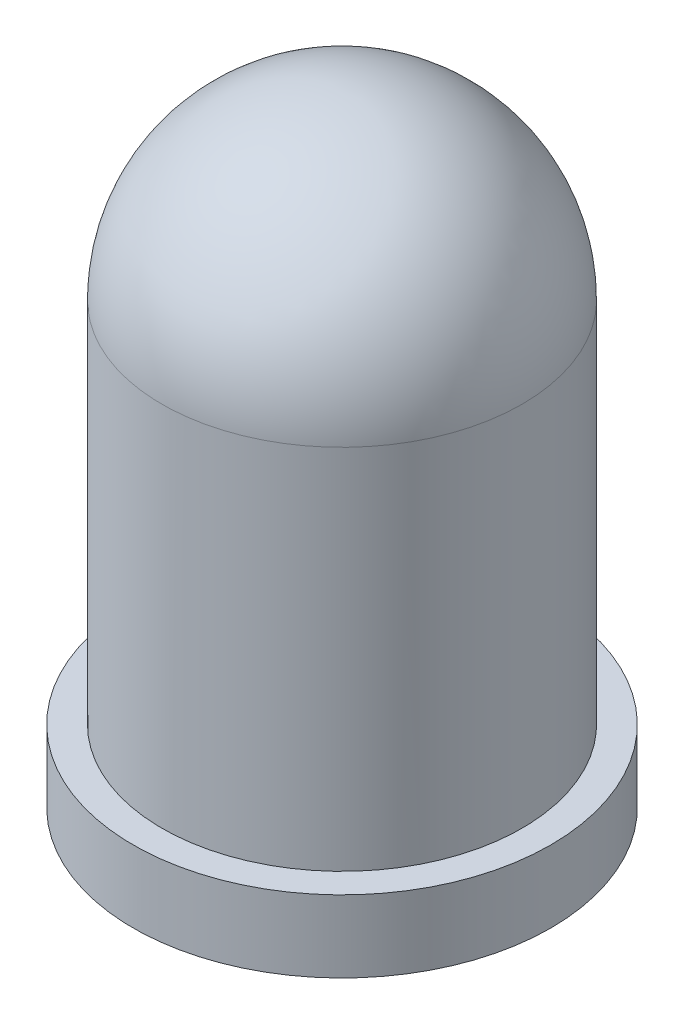
ISO-10303-21;
HEADER;
FILE_DESCRIPTION(('STEP AP214'),'2;1');
FILE_NAME('part.step','',(''),(''),'','','');
FILE_SCHEMA(('AUTOMOTIVE_DESIGN { 1 0 10303 214 1 1 1 1 }'));
ENDSEC;
DATA;
#1=APPLICATION_CONTEXT('core data for automotive mechanical design processes');
#2=APPLICATION_PROTOCOL_DEFINITION('international standard','automotive_design',2000,#1);
#3=PRODUCT_CONTEXT('',#1,'mechanical');
#4=PRODUCT('Part','Part','',(#3));
#5=PRODUCT_RELATED_PRODUCT_CATEGORY('part','',(#4));
#6=PRODUCT_DEFINITION_FORMATION('','',#4);
#7=PRODUCT_DEFINITION_CONTEXT('part definition',#1,'design');
#8=PRODUCT_DEFINITION('design','',#6,#7);
#9=PRODUCT_DEFINITION_SHAPE('','',#8);
#10=(LENGTH_UNIT() NAMED_UNIT(*) SI_UNIT(.MILLI.,.METRE.));
#11=(NAMED_UNIT(*) PLANE_ANGLE_UNIT() SI_UNIT($,.RADIAN.));
#12=(NAMED_UNIT(*) SI_UNIT($,.STERADIAN.) SOLID_ANGLE_UNIT());
#13=UNCERTAINTY_MEASURE_WITH_UNIT(LENGTH_MEASURE(1.E-05),#10,'distance_accuracy_value','');
#14=(GEOMETRIC_REPRESENTATION_CONTEXT(3) GLOBAL_UNCERTAINTY_ASSIGNED_CONTEXT((#13)) GLOBAL_UNIT_ASSIGNED_CONTEXT((#10,
#11,#12)) REPRESENTATION_CONTEXT('',''));
#15=CARTESIAN_POINT('',(0.,0.,0.));
#16=DIRECTION('',(0.,0.,1.));
#17=DIRECTION('',(1.,0.,0.));
#18=AXIS2_PLACEMENT_3D('',#15,#16,#17);
#19=CARTESIAN_POINT('',(0.,0.,0.));
#20=DIRECTION('',(0.,1.,0.));
#21=DIRECTION('',(-1.,0.,0.));
#22=AXIS2_PLACEMENT_3D('',#19,#20,#21);
#23=PLANE('',#22);
#24=CARTESIAN_POINT('',(0.,0.,0.));
#25=DIRECTION('',(0.,1.,0.));
#26=DIRECTION('',(-1.,0.,0.));
#27=AXIS2_PLACEMENT_3D('',#24,#25,#26);
#28=CIRCLE('',#27,2.9);
#29=CARTESIAN_POINT('',(-2.9,0.,0.));
#30=VERTEX_POINT('',#29);
#31=EDGE_CURVE('E10',#30,#30,#28,.T.);
#32=ORIENTED_EDGE('',*,*,#31,.F.);
#33=EDGE_LOOP('',(#32));
#34=FACE_BOUND('',#33,.T.);
#35=ADVANCED_FACE('F30',(#34),#23,.F.);
#36=CARTESIAN_POINT('',(0.,8.6,0.));
#37=DIRECTION('',(0.,1.,0.));
#38=DIRECTION('',(-1.,0.,0.));
#39=AXIS2_PLACEMENT_3D('',#36,#37,#38);
#40=CYLINDRICAL_SURFACE('',#39,2.9);
#41=CARTESIAN_POINT('',(0.,1.,0.));
#42=DIRECTION('',(0.,1.,0.));
#43=DIRECTION('',(-1.,0.,0.));
#44=AXIS2_PLACEMENT_3D('',#41,#42,#43);
#45=CIRCLE('',#44,2.9);
#46=CARTESIAN_POINT('',(-2.9,1.,0.));
#47=VERTEX_POINT('',#46);
#48=EDGE_CURVE('E36',#47,#47,#45,.T.);
#49=ORIENTED_EDGE('',*,*,#48,.F.);
#50=EDGE_LOOP('',(#49));
#51=FACE_BOUND('',#50,.T.);
#52=ORIENTED_EDGE('',*,*,#31,.T.);
#53=EDGE_LOOP('',(#52));
#54=FACE_BOUND('',#53,.T.);
#55=ADVANCED_FACE('F60',(#51,#54),#40,.T.);
#56=CARTESIAN_POINT('',(2.9,1.,0.));
#57=DIRECTION('',(0.,-1.,0.));
#58=DIRECTION('',(1.,0.,0.));
#59=AXIS2_PLACEMENT_3D('',#56,#57,#58);
#60=PLANE('',#59);
#61=CARTESIAN_POINT('',(0.,1.,0.));
#62=DIRECTION('',(0.,1.,0.));
#63=DIRECTION('',(-1.,0.,0.));
#64=AXIS2_PLACEMENT_3D('',#61,#62,#63);
#65=CIRCLE('',#64,2.5);
#66=CARTESIAN_POINT('',(-2.5,1.,0.));
#67=VERTEX_POINT('',#66);
#68=EDGE_CURVE('E40',#67,#67,#65,.T.);
#69=ORIENTED_EDGE('',*,*,#68,.F.);
#70=EDGE_LOOP('',(#69));
#71=FACE_BOUND('',#70,.T.);
#72=ORIENTED_EDGE('',*,*,#48,.T.);
#73=EDGE_LOOP('',(#72));
#74=FACE_BOUND('',#73,.T.);
#75=ADVANCED_FACE('F55',(#71,#74),#60,.F.);
#76=CARTESIAN_POINT('',(0.,8.6,0.));
#77=DIRECTION('',(0.,1.,0.));
#78=DIRECTION('',(-1.,0.,0.));
#79=AXIS2_PLACEMENT_3D('',#76,#77,#78);
#80=CYLINDRICAL_SURFACE('',#79,2.5);
#81=CARTESIAN_POINT('',(0.,6.1,0.));
#82=DIRECTION('',(0.,1.,0.));
#83=DIRECTION('',(-1.,0.,0.));
#84=AXIS2_PLACEMENT_3D('',#81,#82,#83);
#85=CIRCLE('',#84,2.5);
#86=CARTESIAN_POINT('',(-2.5,6.1,0.));
#87=VERTEX_POINT('',#86);
#88=EDGE_CURVE('E44',#87,#87,#85,.T.);
#89=ORIENTED_EDGE('',*,*,#88,.F.);
#90=EDGE_LOOP('',(#89));
#91=FACE_BOUND('',#90,.T.);
#92=ORIENTED_EDGE('',*,*,#68,.T.);
#93=EDGE_LOOP('',(#92));
#94=FACE_BOUND('',#93,.T.);
#95=ADVANCED_FACE('F52',(#91,#94),#80,.T.);
#96=CARTESIAN_POINT('',(0.,6.1,0.));
#97=DIRECTION('',(0.,1.,0.));
#98=DIRECTION('',(1.,0.,0.));
#99=AXIS2_PLACEMENT_3D('',#96,#97,#98);
#100=SPHERICAL_SURFACE('',#99,2.5);
#101=ORIENTED_EDGE('',*,*,#88,.T.);
#102=EDGE_LOOP('',(#101));
#103=FACE_BOUND('',#102,.T.);
#104=ADVANCED_FACE('F50',(#103),#100,.T.);
#105=CLOSED_SHELL('',(#35,#55,#75,#95,#104));
#106=MANIFOLD_SOLID_BREP('B2',#105);
#107=ADVANCED_BREP_SHAPE_REPRESENTATION('',(#18,#106),#14);
#108=SHAPE_DEFINITION_REPRESENTATION(#9,#107);
ENDSEC;
END-ISO-10303-21;
